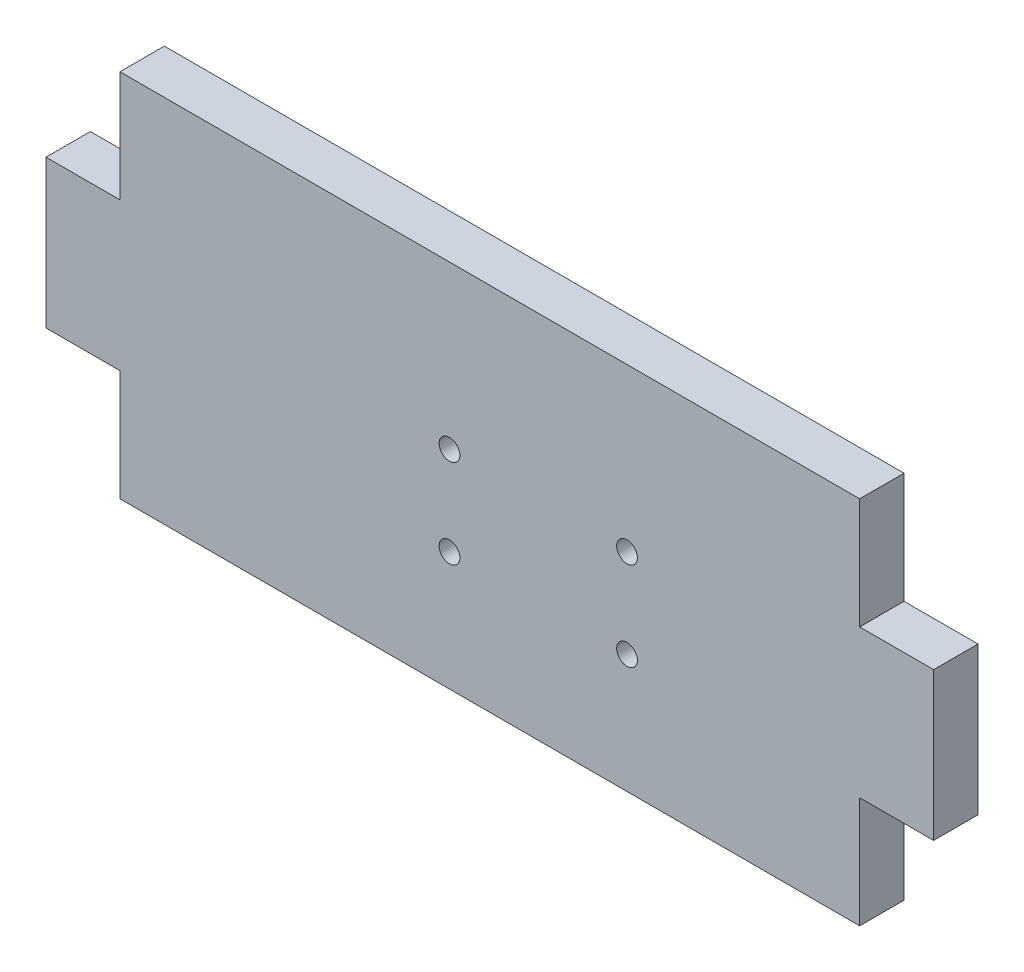
ISO-10303-21;
HEADER;
FILE_DESCRIPTION(('STEP AP214'),'2;1');
FILE_NAME('part.step','',(''),(''),'','','');
FILE_SCHEMA(('AUTOMOTIVE_DESIGN { 1 0 10303 214 1 1 1 1 }'));
ENDSEC;
DATA;
#1=APPLICATION_CONTEXT('core data for automotive mechanical design processes');
#2=APPLICATION_PROTOCOL_DEFINITION('international standard','automotive_design',2000,#1);
#3=PRODUCT_CONTEXT('',#1,'mechanical');
#4=PRODUCT('Part','Part','',(#3));
#5=PRODUCT_RELATED_PRODUCT_CATEGORY('part','',(#4));
#6=PRODUCT_DEFINITION_FORMATION('','',#4);
#7=PRODUCT_DEFINITION_CONTEXT('part definition',#1,'design');
#8=PRODUCT_DEFINITION('design','',#6,#7);
#9=PRODUCT_DEFINITION_SHAPE('','',#8);
#10=(LENGTH_UNIT() NAMED_UNIT(*) SI_UNIT(.MILLI.,.METRE.));
#11=(NAMED_UNIT(*) PLANE_ANGLE_UNIT() SI_UNIT($,.RADIAN.));
#12=(NAMED_UNIT(*) SI_UNIT($,.STERADIAN.) SOLID_ANGLE_UNIT());
#13=UNCERTAINTY_MEASURE_WITH_UNIT(LENGTH_MEASURE(1.E-05),#10,'distance_accuracy_value','');
#14=(GEOMETRIC_REPRESENTATION_CONTEXT(3) GLOBAL_UNCERTAINTY_ASSIGNED_CONTEXT((#13)) GLOBAL_UNIT_ASSIGNED_CONTEXT((#10,
#11,#12)) REPRESENTATION_CONTEXT('',''));
#15=CARTESIAN_POINT('',(0.,0.,0.));
#16=DIRECTION('',(0.,0.,1.));
#17=DIRECTION('',(1.,0.,0.));
#18=AXIS2_PLACEMENT_3D('',#15,#16,#17);
#19=CARTESIAN_POINT('',(44.550340057059,16.0653133446784,9.95979797464467));
#20=DIRECTION('',(0.,0.,-1.));
#21=DIRECTION('',(-1.,0.,0.));
#22=AXIS2_PLACEMENT_3D('',#19,#20,#21);
#23=CYLINDRICAL_SURFACE('',#22,1.4);
#24=CARTESIAN_POINT('',(44.550340057059,16.0653133446784,6.));
#25=DIRECTION('',(0.,0.,1.));
#26=DIRECTION('',(1.,0.,0.));
#27=AXIS2_PLACEMENT_3D('',#24,#25,#26);
#28=CIRCLE('',#27,1.4);
#29=CARTESIAN_POINT('',(45.950340057059,16.0653133446784,6.));
#30=VERTEX_POINT('',#29);
#31=EDGE_CURVE('E167',#30,#30,#28,.F.);
#32=ORIENTED_EDGE('',*,*,#31,.F.);
#33=EDGE_LOOP('',(#32));
#34=FACE_BOUND('',#33,.T.);
#35=CARTESIAN_POINT('',(44.550340057059,16.0653133446784,4.));
#36=DIRECTION('',(0.,0.,-1.));
#37=DIRECTION('',(-1.,0.,0.));
#38=AXIS2_PLACEMENT_3D('',#35,#36,#37);
#39=CIRCLE('',#38,1.4);
#40=CARTESIAN_POINT('',(43.150340057059,16.0653133446784,4.));
#41=VERTEX_POINT('',#40);
#42=EDGE_CURVE('E41',#41,#41,#39,.F.);
#43=ORIENTED_EDGE('',*,*,#42,.F.);
#44=EDGE_LOOP('',(#43));
#45=FACE_BOUND('',#44,.T.);
#46=ADVANCED_FACE('F37',(#34,#45),#23,.F.);
#47=CARTESIAN_POINT('',(44.550340057059,28.0653133446784,9.95979797464467));
#48=DIRECTION('',(0.,0.,-1.));
#49=DIRECTION('',(-1.,0.,0.));
#50=AXIS2_PLACEMENT_3D('',#47,#48,#49);
#51=CYLINDRICAL_SURFACE('',#50,1.4);
#52=CARTESIAN_POINT('',(44.550340057059,28.0653133446784,6.));
#53=DIRECTION('',(0.,0.,1.));
#54=DIRECTION('',(1.,0.,0.));
#55=AXIS2_PLACEMENT_3D('',#52,#53,#54);
#56=CIRCLE('',#55,1.4);
#57=CARTESIAN_POINT('',(45.950340057059,28.0653133446784,6.));
#58=VERTEX_POINT('',#57);
#59=EDGE_CURVE('E230',#58,#58,#56,.F.);
#60=ORIENTED_EDGE('',*,*,#59,.F.);
#61=EDGE_LOOP('',(#60));
#62=FACE_BOUND('',#61,.T.);
#63=CARTESIAN_POINT('',(44.550340057059,28.0653133446784,4.));
#64=DIRECTION('',(0.,0.,-1.));
#65=DIRECTION('',(-1.,0.,0.));
#66=AXIS2_PLACEMENT_3D('',#63,#64,#65);
#67=CIRCLE('',#66,1.4);
#68=CARTESIAN_POINT('',(43.150340057059,28.0653133446784,4.));
#69=VERTEX_POINT('',#68);
#70=EDGE_CURVE('E216',#69,#69,#67,.F.);
#71=ORIENTED_EDGE('',*,*,#70,.F.);
#72=EDGE_LOOP('',(#71));
#73=FACE_BOUND('',#72,.T.);
#74=ADVANCED_FACE('F272',(#62,#73),#51,.F.);
#75=CARTESIAN_POINT('',(68.550340057059,28.0653133446784,9.95979797464467));
#76=DIRECTION('',(0.,0.,-1.));
#77=DIRECTION('',(-1.,0.,0.));
#78=AXIS2_PLACEMENT_3D('',#75,#76,#77);
#79=CYLINDRICAL_SURFACE('',#78,1.4);
#80=CARTESIAN_POINT('',(68.550340057059,28.0653133446784,6.));
#81=DIRECTION('',(0.,0.,1.));
#82=DIRECTION('',(1.,0.,0.));
#83=AXIS2_PLACEMENT_3D('',#80,#81,#82);
#84=CIRCLE('',#83,1.4);
#85=CARTESIAN_POINT('',(69.950340057059,28.0653133446784,6.));
#86=VERTEX_POINT('',#85);
#87=EDGE_CURVE('E225',#86,#86,#84,.F.);
#88=ORIENTED_EDGE('',*,*,#87,.F.);
#89=EDGE_LOOP('',(#88));
#90=FACE_BOUND('',#89,.T.);
#91=CARTESIAN_POINT('',(68.550340057059,28.0653133446784,4.));
#92=DIRECTION('',(0.,0.,-1.));
#93=DIRECTION('',(-1.,0.,0.));
#94=AXIS2_PLACEMENT_3D('',#91,#92,#93);
#95=CIRCLE('',#94,1.4);
#96=CARTESIAN_POINT('',(67.150340057059,28.0653133446784,4.));
#97=VERTEX_POINT('',#96);
#98=EDGE_CURVE('E213',#97,#97,#95,.F.);
#99=ORIENTED_EDGE('',*,*,#98,.F.);
#100=EDGE_LOOP('',(#99));
#101=FACE_BOUND('',#100,.T.);
#102=ADVANCED_FACE('F278',(#90,#101),#79,.F.);
#103=CARTESIAN_POINT('',(68.550340057059,16.0653133446784,9.95979797464467));
#104=DIRECTION('',(0.,0.,-1.));
#105=DIRECTION('',(-1.,0.,0.));
#106=AXIS2_PLACEMENT_3D('',#103,#104,#105);
#107=CYLINDRICAL_SURFACE('',#106,1.4);
#108=CARTESIAN_POINT('',(68.550340057059,16.0653133446784,6.));
#109=DIRECTION('',(0.,0.,1.));
#110=DIRECTION('',(1.,0.,0.));
#111=AXIS2_PLACEMENT_3D('',#108,#109,#110);
#112=CIRCLE('',#111,1.4);
#113=CARTESIAN_POINT('',(69.950340057059,16.0653133446784,6.));
#114=VERTEX_POINT('',#113);
#115=EDGE_CURVE('E221',#114,#114,#112,.F.);
#116=ORIENTED_EDGE('',*,*,#115,.F.);
#117=EDGE_LOOP('',(#116));
#118=FACE_BOUND('',#117,.T.);
#119=CARTESIAN_POINT('',(68.550340057059,16.0653133446784,4.));
#120=DIRECTION('',(0.,0.,-1.));
#121=DIRECTION('',(-1.,0.,0.));
#122=AXIS2_PLACEMENT_3D('',#119,#120,#121);
#123=CIRCLE('',#122,1.4);
#124=CARTESIAN_POINT('',(67.150340057059,16.0653133446784,4.));
#125=VERTEX_POINT('',#124);
#126=EDGE_CURVE('E210',#125,#125,#123,.F.);
#127=ORIENTED_EDGE('',*,*,#126,.F.);
#128=EDGE_LOOP('',(#127));
#129=FACE_BOUND('',#128,.T.);
#130=ADVANCED_FACE('F284',(#118,#129),#107,.F.);
#131=CARTESIAN_POINT('',(0.,35.,6.));
#132=DIRECTION('',(0.,-1.,0.));
#133=DIRECTION('',(0.,0.,-1.));
#134=AXIS2_PLACEMENT_3D('',#131,#132,#133);
#135=PLANE('',#134);
#136=DIRECTION('',(-1.,0.,0.));
#137=VECTOR('',#136,1.);
#138=CARTESIAN_POINT('',(0.,35.,0.));
#139=LINE('',#138,#137);
#140=CARTESIAN_POINT('',(0.,35.,0.));
#141=VERTEX_POINT('',#140);
#142=CARTESIAN_POINT('',(-10.,35.,0.));
#143=VERTEX_POINT('',#142);
#144=EDGE_CURVE('E164',#141,#143,#139,.T.);
#145=ORIENTED_EDGE('',*,*,#144,.T.);
#146=DIRECTION('',(0.,0.,-1.));
#147=VECTOR('',#146,1.);
#148=CARTESIAN_POINT('',(-10.,35.,6.));
#149=LINE('',#148,#147);
#150=CARTESIAN_POINT('',(-10.,35.,6.));
#151=VERTEX_POINT('',#150);
#152=EDGE_CURVE('E11',#151,#143,#149,.T.);
#153=ORIENTED_EDGE('',*,*,#152,.F.);
#154=DIRECTION('',(-1.,0.,0.));
#155=VECTOR('',#154,1.);
#156=CARTESIAN_POINT('',(0.,35.,6.));
#157=LINE('',#156,#155);
#158=CARTESIAN_POINT('',(0.,35.,6.));
#159=VERTEX_POINT('',#158);
#160=EDGE_CURVE('E236',#159,#151,#157,.T.);
#161=ORIENTED_EDGE('',*,*,#160,.F.);
#162=DIRECTION('',(0.,0.,-1.));
#163=VECTOR('',#162,1.);
#164=CARTESIAN_POINT('',(0.,35.,6.));
#165=LINE('',#164,#163);
#166=EDGE_CURVE('E56',#159,#141,#165,.T.);
#167=ORIENTED_EDGE('',*,*,#166,.T.);
#168=EDGE_LOOP('',(#145,#153,#161,#167));
#169=FACE_BOUND('',#168,.T.);
#170=ADVANCED_FACE('F39',(#169),#135,.F.);
#171=CARTESIAN_POINT('',(-10.,0.,6.));
#172=DIRECTION('',(1.,0.,0.));
#173=DIRECTION('',(0.,1.,0.));
#174=AXIS2_PLACEMENT_3D('',#171,#172,#173);
#175=PLANE('',#174);
#176=DIRECTION('',(0.,-1.,0.));
#177=VECTOR('',#176,1.);
#178=CARTESIAN_POINT('',(-10.,0.,0.));
#179=LINE('',#178,#177);
#180=CARTESIAN_POINT('',(-10.,15.,0.));
#181=VERTEX_POINT('',#180);
#182=EDGE_CURVE('E166',#143,#181,#179,.T.);
#183=ORIENTED_EDGE('',*,*,#182,.T.);
#184=DIRECTION('',(0.,0.,-1.));
#185=VECTOR('',#184,1.);
#186=CARTESIAN_POINT('',(-10.,15.,6.));
#187=LINE('',#186,#185);
#188=CARTESIAN_POINT('',(-10.,15.,6.));
#189=VERTEX_POINT('',#188);
#190=EDGE_CURVE('E47',#189,#181,#187,.T.);
#191=ORIENTED_EDGE('',*,*,#190,.F.);
#192=DIRECTION('',(0.,-1.,0.));
#193=VECTOR('',#192,1.);
#194=CARTESIAN_POINT('',(-10.,0.,6.));
#195=LINE('',#194,#193);
#196=EDGE_CURVE('E106',#151,#189,#195,.T.);
#197=ORIENTED_EDGE('',*,*,#196,.F.);
#198=ORIENTED_EDGE('',*,*,#152,.T.);
#199=EDGE_LOOP('',(#183,#191,#197,#198));
#200=FACE_BOUND('',#199,.T.);
#201=ADVANCED_FACE('F376',(#200),#175,.F.);
#202=CARTESIAN_POINT('',(0.,15.,6.));
#203=DIRECTION('',(0.,-1.,0.));
#204=DIRECTION('',(0.,0.,-1.));
#205=AXIS2_PLACEMENT_3D('',#202,#203,#204);
#206=PLANE('',#205);
#207=DIRECTION('',(-1.,0.,0.));
#208=VECTOR('',#207,1.);
#209=CARTESIAN_POINT('',(0.,15.,0.));
#210=LINE('',#209,#208);
#211=CARTESIAN_POINT('',(0.,15.,0.));
#212=VERTEX_POINT('',#211);
#213=EDGE_CURVE('E170',#212,#181,#210,.T.);
#214=ORIENTED_EDGE('',*,*,#213,.F.);
#215=DIRECTION('',(0.,0.,-1.));
#216=VECTOR('',#215,1.);
#217=CARTESIAN_POINT('',(0.,15.,6.));
#218=LINE('',#217,#216);
#219=CARTESIAN_POINT('',(0.,15.,6.));
#220=VERTEX_POINT('',#219);
#221=EDGE_CURVE('E207',#220,#212,#218,.T.);
#222=ORIENTED_EDGE('',*,*,#221,.F.);
#223=DIRECTION('',(-1.,0.,0.));
#224=VECTOR('',#223,1.);
#225=CARTESIAN_POINT('',(0.,15.,6.));
#226=LINE('',#225,#224);
#227=EDGE_CURVE('E239',#220,#189,#226,.T.);
#228=ORIENTED_EDGE('',*,*,#227,.T.);
#229=ORIENTED_EDGE('',*,*,#190,.T.);
#230=EDGE_LOOP('',(#214,#222,#228,#229));
#231=FACE_BOUND('',#230,.T.);
#232=ADVANCED_FACE('F269',(#231),#206,.T.);
#233=CARTESIAN_POINT('',(0.,0.,6.));
#234=DIRECTION('',(-1.,0.,0.));
#235=DIRECTION('',(0.,0.,1.));
#236=AXIS2_PLACEMENT_3D('',#233,#234,#235);
#237=PLANE('',#236);
#238=DIRECTION('',(0.,1.,0.));
#239=VECTOR('',#238,1.);
#240=CARTESIAN_POINT('',(0.,0.,0.));
#241=LINE('',#240,#239);
#242=CARTESIAN_POINT('',(0.,0.,0.));
#243=VERTEX_POINT('',#242);
#244=EDGE_CURVE('E173',#243,#212,#241,.T.);
#245=ORIENTED_EDGE('',*,*,#244,.F.);
#246=DIRECTION('',(0.,0.,-1.));
#247=VECTOR('',#246,1.);
#248=CARTESIAN_POINT('',(0.,0.,6.));
#249=LINE('',#248,#247);
#250=CARTESIAN_POINT('',(0.,0.,6.));
#251=VERTEX_POINT('',#250);
#252=EDGE_CURVE('E205',#251,#243,#249,.T.);
#253=ORIENTED_EDGE('',*,*,#252,.F.);
#254=DIRECTION('',(0.,1.,0.));
#255=VECTOR('',#254,1.);
#256=CARTESIAN_POINT('',(0.,0.,6.));
#257=LINE('',#256,#255);
#258=EDGE_CURVE('E160',#251,#220,#257,.T.);
#259=ORIENTED_EDGE('',*,*,#258,.T.);
#260=ORIENTED_EDGE('',*,*,#221,.T.);
#261=EDGE_LOOP('',(#245,#253,#259,#260));
#262=FACE_BOUND('',#261,.T.);
#263=ADVANCED_FACE('F259',(#262),#237,.T.);
#264=CARTESIAN_POINT('',(0.,0.,6.));
#265=DIRECTION('',(0.,1.,0.));
#266=DIRECTION('',(0.,0.,1.));
#267=AXIS2_PLACEMENT_3D('',#264,#265,#266);
#268=PLANE('',#267);
#269=DIRECTION('',(1.,0.,0.));
#270=VECTOR('',#269,1.);
#271=CARTESIAN_POINT('',(0.,0.,0.));
#272=LINE('',#271,#270);
#273=CARTESIAN_POINT('',(100.,0.,0.));
#274=VERTEX_POINT('',#273);
#275=EDGE_CURVE('E176',#243,#274,#272,.T.);
#276=ORIENTED_EDGE('',*,*,#275,.T.);
#277=DIRECTION('',(0.,0.,-1.));
#278=VECTOR('',#277,1.);
#279=CARTESIAN_POINT('',(100.,0.,6.));
#280=LINE('',#279,#278);
#281=CARTESIAN_POINT('',(100.,0.,6.));
#282=VERTEX_POINT('',#281);
#283=EDGE_CURVE('E202',#282,#274,#280,.T.);
#284=ORIENTED_EDGE('',*,*,#283,.F.);
#285=DIRECTION('',(1.,0.,0.));
#286=VECTOR('',#285,1.);
#287=CARTESIAN_POINT('',(0.,0.,6.));
#288=LINE('',#287,#286);
#289=EDGE_CURVE('E243',#251,#282,#288,.T.);
#290=ORIENTED_EDGE('',*,*,#289,.F.);
#291=ORIENTED_EDGE('',*,*,#252,.T.);
#292=EDGE_LOOP('',(#276,#284,#290,#291));
#293=FACE_BOUND('',#292,.T.);
#294=ADVANCED_FACE('F268',(#293),#268,.F.);
#295=CARTESIAN_POINT('',(100.,0.,6.));
#296=DIRECTION('',(-1.,0.,0.));
#297=DIRECTION('',(0.,0.,1.));
#298=AXIS2_PLACEMENT_3D('',#295,#296,#297);
#299=PLANE('',#298);
#300=DIRECTION('',(0.,1.,0.));
#301=VECTOR('',#300,1.);
#302=CARTESIAN_POINT('',(100.,0.,0.));
#303=LINE('',#302,#301);
#304=CARTESIAN_POINT('',(100.,15.,0.));
#305=VERTEX_POINT('',#304);
#306=EDGE_CURVE('E179',#274,#305,#303,.T.);
#307=ORIENTED_EDGE('',*,*,#306,.T.);
#308=DIRECTION('',(0.,0.,-1.));
#309=VECTOR('',#308,1.);
#310=CARTESIAN_POINT('',(100.,15.,6.));
#311=LINE('',#310,#309);
#312=CARTESIAN_POINT('',(100.,15.,6.));
#313=VERTEX_POINT('',#312);
#314=EDGE_CURVE('E199',#313,#305,#311,.T.);
#315=ORIENTED_EDGE('',*,*,#314,.F.);
#316=DIRECTION('',(0.,1.,0.));
#317=VECTOR('',#316,1.);
#318=CARTESIAN_POINT('',(100.,0.,6.));
#319=LINE('',#318,#317);
#320=EDGE_CURVE('E146',#282,#313,#319,.T.);
#321=ORIENTED_EDGE('',*,*,#320,.F.);
#322=ORIENTED_EDGE('',*,*,#283,.T.);
#323=EDGE_LOOP('',(#307,#315,#321,#322));
#324=FACE_BOUND('',#323,.T.);
#325=ADVANCED_FACE('F398',(#324),#299,.F.);
#326=CARTESIAN_POINT('',(0.,15.,6.));
#327=DIRECTION('',(0.,1.,0.));
#328=DIRECTION('',(0.,0.,1.));
#329=AXIS2_PLACEMENT_3D('',#326,#327,#328);
#330=PLANE('',#329);
#331=DIRECTION('',(1.,0.,0.));
#332=VECTOR('',#331,1.);
#333=CARTESIAN_POINT('',(0.,15.,0.));
#334=LINE('',#333,#332);
#335=CARTESIAN_POINT('',(110.,15.,0.));
#336=VERTEX_POINT('',#335);
#337=EDGE_CURVE('E181',#305,#336,#334,.T.);
#338=ORIENTED_EDGE('',*,*,#337,.T.);
#339=DIRECTION('',(0.,0.,-1.));
#340=VECTOR('',#339,1.);
#341=CARTESIAN_POINT('',(110.,15.,6.));
#342=LINE('',#341,#340);
#343=CARTESIAN_POINT('',(110.,15.,6.));
#344=VERTEX_POINT('',#343);
#345=EDGE_CURVE('E197',#344,#336,#342,.T.);
#346=ORIENTED_EDGE('',*,*,#345,.F.);
#347=DIRECTION('',(1.,0.,0.));
#348=VECTOR('',#347,1.);
#349=CARTESIAN_POINT('',(0.,15.,6.));
#350=LINE('',#349,#348);
#351=EDGE_CURVE('E245',#313,#344,#350,.T.);
#352=ORIENTED_EDGE('',*,*,#351,.F.);
#353=ORIENTED_EDGE('',*,*,#314,.T.);
#354=EDGE_LOOP('',(#338,#346,#352,#353));
#355=FACE_BOUND('',#354,.T.);
#356=ADVANCED_FACE('F402',(#355),#330,.F.);
#357=CARTESIAN_POINT('',(110.,0.,6.));
#358=DIRECTION('',(1.,0.,0.));
#359=DIRECTION('',(0.,0.,-1.));
#360=AXIS2_PLACEMENT_3D('',#357,#358,#359);
#361=PLANE('',#360);
#362=DIRECTION('',(0.,-1.,0.));
#363=VECTOR('',#362,1.);
#364=CARTESIAN_POINT('',(110.,0.,0.));
#365=LINE('',#364,#363);
#366=CARTESIAN_POINT('',(110.,35.,0.));
#367=VERTEX_POINT('',#366);
#368=EDGE_CURVE('E184',#367,#336,#365,.T.);
#369=ORIENTED_EDGE('',*,*,#368,.F.);
#370=DIRECTION('',(0.,0.,-1.));
#371=VECTOR('',#370,1.);
#372=CARTESIAN_POINT('',(110.,35.,6.));
#373=LINE('',#372,#371);
#374=CARTESIAN_POINT('',(110.,35.,6.));
#375=VERTEX_POINT('',#374);
#376=EDGE_CURVE('E195',#375,#367,#373,.T.);
#377=ORIENTED_EDGE('',*,*,#376,.F.);
#378=DIRECTION('',(0.,-1.,0.));
#379=VECTOR('',#378,1.);
#380=CARTESIAN_POINT('',(110.,0.,6.));
#381=LINE('',#380,#379);
#382=EDGE_CURVE('E246',#375,#344,#381,.T.);
#383=ORIENTED_EDGE('',*,*,#382,.T.);
#384=ORIENTED_EDGE('',*,*,#345,.T.);
#385=EDGE_LOOP('',(#369,#377,#383,#384));
#386=FACE_BOUND('',#385,.T.);
#387=ADVANCED_FACE('F403',(#386),#361,.T.);
#388=CARTESIAN_POINT('',(0.,35.,6.));
#389=DIRECTION('',(0.,1.,0.));
#390=DIRECTION('',(0.,0.,1.));
#391=AXIS2_PLACEMENT_3D('',#388,#389,#390);
#392=PLANE('',#391);
#393=DIRECTION('',(1.,0.,0.));
#394=VECTOR('',#393,1.);
#395=CARTESIAN_POINT('',(0.,35.,0.));
#396=LINE('',#395,#394);
#397=CARTESIAN_POINT('',(100.,35.,0.));
#398=VERTEX_POINT('',#397);
#399=EDGE_CURVE('E187',#398,#367,#396,.T.);
#400=ORIENTED_EDGE('',*,*,#399,.F.);
#401=DIRECTION('',(0.,0.,-1.));
#402=VECTOR('',#401,1.);
#403=CARTESIAN_POINT('',(100.,35.,6.));
#404=LINE('',#403,#402);
#405=CARTESIAN_POINT('',(100.,35.,6.));
#406=VERTEX_POINT('',#405);
#407=EDGE_CURVE('E154',#406,#398,#404,.T.);
#408=ORIENTED_EDGE('',*,*,#407,.F.);
#409=DIRECTION('',(1.,0.,0.));
#410=VECTOR('',#409,1.);
#411=CARTESIAN_POINT('',(0.,35.,6.));
#412=LINE('',#411,#410);
#413=EDGE_CURVE('E143',#406,#375,#412,.T.);
#414=ORIENTED_EDGE('',*,*,#413,.T.);
#415=ORIENTED_EDGE('',*,*,#376,.T.);
#416=EDGE_LOOP('',(#400,#408,#414,#415));
#417=FACE_BOUND('',#416,.T.);
#418=ADVANCED_FACE('F251',(#417),#392,.T.);
#419=CARTESIAN_POINT('',(100.,50.,0.));
#420=VERTEX_POINT('',#419);
#421=EDGE_CURVE('E151',#398,#420,#303,.T.);
#422=ORIENTED_EDGE('',*,*,#421,.T.);
#423=DIRECTION('',(0.,0.,-1.));
#424=VECTOR('',#423,1.);
#425=CARTESIAN_POINT('',(100.,50.,6.));
#426=LINE('',#425,#424);
#427=CARTESIAN_POINT('',(100.,50.,6.));
#428=VERTEX_POINT('',#427);
#429=EDGE_CURVE('E148',#428,#420,#426,.T.);
#430=ORIENTED_EDGE('',*,*,#429,.F.);
#431=EDGE_CURVE('E135',#406,#428,#319,.T.);
#432=ORIENTED_EDGE('',*,*,#431,.F.);
#433=ORIENTED_EDGE('',*,*,#407,.T.);
#434=EDGE_LOOP('',(#422,#430,#432,#433));
#435=FACE_BOUND('',#434,.T.);
#436=ADVANCED_FACE('F149',(#435),#299,.F.);
#437=CARTESIAN_POINT('',(0.,50.,6.));
#438=DIRECTION('',(0.,1.,0.));
#439=DIRECTION('',(0.,0.,1.));
#440=AXIS2_PLACEMENT_3D('',#437,#438,#439);
#441=PLANE('',#440);
#442=DIRECTION('',(1.,0.,0.));
#443=VECTOR('',#442,1.);
#444=CARTESIAN_POINT('',(0.,50.,0.));
#445=LINE('',#444,#443);
#446=CARTESIAN_POINT('',(0.,50.,0.));
#447=VERTEX_POINT('',#446);
#448=EDGE_CURVE('E190',#447,#420,#445,.T.);
#449=ORIENTED_EDGE('',*,*,#448,.F.);
#450=DIRECTION('',(0.,0.,-1.));
#451=VECTOR('',#450,1.);
#452=CARTESIAN_POINT('',(0.,50.,6.));
#453=LINE('',#452,#451);
#454=CARTESIAN_POINT('',(0.,50.,6.));
#455=VERTEX_POINT('',#454);
#456=EDGE_CURVE('E94',#455,#447,#453,.T.);
#457=ORIENTED_EDGE('',*,*,#456,.F.);
#458=DIRECTION('',(1.,0.,0.));
#459=VECTOR('',#458,1.);
#460=CARTESIAN_POINT('',(0.,50.,6.));
#461=LINE('',#460,#459);
#462=EDGE_CURVE('E140',#455,#428,#461,.T.);
#463=ORIENTED_EDGE('',*,*,#462,.T.);
#464=ORIENTED_EDGE('',*,*,#429,.T.);
#465=EDGE_LOOP('',(#449,#457,#463,#464));
#466=FACE_BOUND('',#465,.T.);
#467=ADVANCED_FACE('F156',(#466),#441,.T.);
#468=EDGE_CURVE('E177',#141,#447,#241,.T.);
#469=ORIENTED_EDGE('',*,*,#468,.F.);
#470=ORIENTED_EDGE('',*,*,#166,.F.);
#471=EDGE_CURVE('E157',#159,#455,#257,.T.);
#472=ORIENTED_EDGE('',*,*,#471,.T.);
#473=ORIENTED_EDGE('',*,*,#456,.T.);
#474=EDGE_LOOP('',(#469,#470,#472,#473));
#475=FACE_BOUND('',#474,.T.);
#476=ADVANCED_FACE('F256',(#475),#237,.T.);
#477=CARTESIAN_POINT('',(0.,0.,6.));
#478=DIRECTION('',(0.,0.,1.));
#479=DIRECTION('',(1.,0.,0.));
#480=AXIS2_PLACEMENT_3D('',#477,#478,#479);
#481=PLANE('',#480);
#482=ORIENTED_EDGE('',*,*,#115,.T.);
#483=EDGE_LOOP('',(#482));
#484=FACE_BOUND('',#483,.T.);
#485=ORIENTED_EDGE('',*,*,#87,.T.);
#486=EDGE_LOOP('',(#485));
#487=FACE_BOUND('',#486,.T.);
#488=ORIENTED_EDGE('',*,*,#59,.T.);
#489=EDGE_LOOP('',(#488));
#490=FACE_BOUND('',#489,.T.);
#491=ORIENTED_EDGE('',*,*,#31,.T.);
#492=EDGE_LOOP('',(#491));
#493=FACE_BOUND('',#492,.T.);
#494=ORIENTED_EDGE('',*,*,#160,.T.);
#495=ORIENTED_EDGE('',*,*,#196,.T.);
#496=ORIENTED_EDGE('',*,*,#227,.F.);
#497=ORIENTED_EDGE('',*,*,#258,.F.);
#498=ORIENTED_EDGE('',*,*,#289,.T.);
#499=ORIENTED_EDGE('',*,*,#320,.T.);
#500=ORIENTED_EDGE('',*,*,#351,.T.);
#501=ORIENTED_EDGE('',*,*,#382,.F.);
#502=ORIENTED_EDGE('',*,*,#413,.F.);
#503=ORIENTED_EDGE('',*,*,#431,.T.);
#504=ORIENTED_EDGE('',*,*,#462,.F.);
#505=ORIENTED_EDGE('',*,*,#471,.F.);
#506=EDGE_LOOP('',(#494,#495,#496,#497,#498,#499,#500,#501,#502,#503,#504,#505));
#507=FACE_BOUND('',#506,.T.);
#508=ADVANCED_FACE('F137',(#484,#487,#490,#493,#507),#481,.T.);
#509=CARTESIAN_POINT('',(0.,0.,0.));
#510=DIRECTION('',(0.,0.,1.));
#511=DIRECTION('',(1.,0.,0.));
#512=AXIS2_PLACEMENT_3D('',#509,#510,#511);
#513=PLANE('',#512);
#514=CARTESIAN_POINT('',(68.550340057059,16.0653133446784,0.));
#515=DIRECTION('',(0.,0.,-1.));
#516=DIRECTION('',(-1.,0.,0.));
#517=AXIS2_PLACEMENT_3D('',#514,#515,#516);
#518=CIRCLE('',#517,3.00000000000001);
#519=CARTESIAN_POINT('',(65.550340057059,16.0653133446784,0.));
#520=VERTEX_POINT('',#519);
#521=EDGE_CURVE('E298',#520,#520,#518,.T.);
#522=ORIENTED_EDGE('',*,*,#521,.F.);
#523=EDGE_LOOP('',(#522));
#524=FACE_BOUND('',#523,.T.);
#525=CARTESIAN_POINT('',(44.550340057059,16.0653133446784,0.));
#526=DIRECTION('',(0.,0.,-1.));
#527=DIRECTION('',(-1.,0.,0.));
#528=AXIS2_PLACEMENT_3D('',#525,#526,#527);
#529=CIRCLE('',#528,3.);
#530=CARTESIAN_POINT('',(41.550340057059,16.0653133446784,0.));
#531=VERTEX_POINT('',#530);
#532=EDGE_CURVE('E302',#531,#531,#529,.T.);
#533=ORIENTED_EDGE('',*,*,#532,.F.);
#534=EDGE_LOOP('',(#533));
#535=FACE_BOUND('',#534,.T.);
#536=CARTESIAN_POINT('',(44.550340057059,28.0653133446784,0.));
#537=DIRECTION('',(0.,0.,-1.));
#538=DIRECTION('',(-1.,0.,0.));
#539=AXIS2_PLACEMENT_3D('',#536,#537,#538);
#540=CIRCLE('',#539,3.);
#541=CARTESIAN_POINT('',(41.550340057059,28.0653133446784,0.));
#542=VERTEX_POINT('',#541);
#543=EDGE_CURVE('E306',#542,#542,#540,.T.);
#544=ORIENTED_EDGE('',*,*,#543,.F.);
#545=EDGE_LOOP('',(#544));
#546=FACE_BOUND('',#545,.T.);
#547=CARTESIAN_POINT('',(68.550340057059,28.0653133446784,0.));
#548=DIRECTION('',(0.,0.,-1.));
#549=DIRECTION('',(-1.,0.,0.));
#550=AXIS2_PLACEMENT_3D('',#547,#548,#549);
#551=CIRCLE('',#550,3.00000000000001);
#552=CARTESIAN_POINT('',(65.550340057059,28.0653133446784,0.));
#553=VERTEX_POINT('',#552);
#554=EDGE_CURVE('E309',#553,#553,#551,.T.);
#555=ORIENTED_EDGE('',*,*,#554,.F.);
#556=EDGE_LOOP('',(#555));
#557=FACE_BOUND('',#556,.T.);
#558=ORIENTED_EDGE('',*,*,#144,.F.);
#559=ORIENTED_EDGE('',*,*,#468,.T.);
#560=ORIENTED_EDGE('',*,*,#448,.T.);
#561=ORIENTED_EDGE('',*,*,#421,.F.);
#562=ORIENTED_EDGE('',*,*,#399,.T.);
#563=ORIENTED_EDGE('',*,*,#368,.T.);
#564=ORIENTED_EDGE('',*,*,#337,.F.);
#565=ORIENTED_EDGE('',*,*,#306,.F.);
#566=ORIENTED_EDGE('',*,*,#275,.F.);
#567=ORIENTED_EDGE('',*,*,#244,.T.);
#568=ORIENTED_EDGE('',*,*,#213,.T.);
#569=ORIENTED_EDGE('',*,*,#182,.F.);
#570=EDGE_LOOP('',(#558,#559,#560,#561,#562,#563,#564,#565,#566,#567,#568,#569));
#571=FACE_BOUND('',#570,.T.);
#572=ADVANCED_FACE('F254',(#524,#535,#546,#557,#571),#513,.F.);
#573=CARTESIAN_POINT('',(68.550340057059,16.0653133446784,4.));
#574=DIRECTION('',(0.,0.,-1.));
#575=DIRECTION('',(-1.,0.,0.));
#576=AXIS2_PLACEMENT_3D('',#573,#574,#575);
#577=PLANE('',#576);
#578=CARTESIAN_POINT('',(68.550340057059,16.0653133446784,4.));
#579=DIRECTION('',(0.,0.,-1.));
#580=DIRECTION('',(-1.,0.,0.));
#581=AXIS2_PLACEMENT_3D('',#578,#579,#580);
#582=CIRCLE('',#581,3.00000000000001);
#583=CARTESIAN_POINT('',(65.550340057059,16.0653133446784,4.));
#584=VERTEX_POINT('',#583);
#585=EDGE_CURVE('E324',#584,#584,#582,.T.);
#586=ORIENTED_EDGE('',*,*,#585,.T.);
#587=EDGE_LOOP('',(#586));
#588=FACE_BOUND('',#587,.T.);
#589=ORIENTED_EDGE('',*,*,#126,.T.);
#590=EDGE_LOOP('',(#589));
#591=FACE_BOUND('',#590,.T.);
#592=ADVANCED_FACE('F287',(#588,#591),#577,.T.);
#593=CARTESIAN_POINT('',(68.550340057059,16.0653133446784,4.));
#594=DIRECTION('',(0.,0.,-1.));
#595=DIRECTION('',(-1.,0.,0.));
#596=AXIS2_PLACEMENT_3D('',#593,#594,#595);
#597=CYLINDRICAL_SURFACE('',#596,3.00000000000001);
#598=ORIENTED_EDGE('',*,*,#585,.F.);
#599=EDGE_LOOP('',(#598));
#600=FACE_BOUND('',#599,.T.);
#601=ORIENTED_EDGE('',*,*,#521,.T.);
#602=EDGE_LOOP('',(#601));
#603=FACE_BOUND('',#602,.T.);
#604=ADVANCED_FACE('F292',(#600,#603),#597,.F.);
#605=CARTESIAN_POINT('',(68.550340057059,28.0653133446784,4.));
#606=DIRECTION('',(0.,0.,-1.));
#607=DIRECTION('',(-1.,0.,0.));
#608=AXIS2_PLACEMENT_3D('',#605,#606,#607);
#609=PLANE('',#608);
#610=CARTESIAN_POINT('',(68.550340057059,28.0653133446784,4.));
#611=DIRECTION('',(0.,0.,-1.));
#612=DIRECTION('',(-1.,0.,0.));
#613=AXIS2_PLACEMENT_3D('',#610,#611,#612);
#614=CIRCLE('',#613,3.00000000000001);
#615=CARTESIAN_POINT('',(65.550340057059,28.0653133446784,4.));
#616=VERTEX_POINT('',#615);
#617=EDGE_CURVE('E214',#616,#616,#614,.T.);
#618=ORIENTED_EDGE('',*,*,#617,.T.);
#619=EDGE_LOOP('',(#618));
#620=FACE_BOUND('',#619,.T.);
#621=ORIENTED_EDGE('',*,*,#98,.T.);
#622=EDGE_LOOP('',(#621));
#623=FACE_BOUND('',#622,.T.);
#624=ADVANCED_FACE('F355',(#620,#623),#609,.T.);
#625=CARTESIAN_POINT('',(68.550340057059,28.0653133446784,4.));
#626=DIRECTION('',(0.,0.,-1.));
#627=DIRECTION('',(-1.,0.,0.));
#628=AXIS2_PLACEMENT_3D('',#625,#626,#627);
#629=CYLINDRICAL_SURFACE('',#628,3.00000000000001);
#630=ORIENTED_EDGE('',*,*,#617,.F.);
#631=EDGE_LOOP('',(#630));
#632=FACE_BOUND('',#631,.T.);
#633=ORIENTED_EDGE('',*,*,#554,.T.);
#634=EDGE_LOOP('',(#633));
#635=FACE_BOUND('',#634,.T.);
#636=ADVANCED_FACE('F345',(#632,#635),#629,.F.);
#637=CARTESIAN_POINT('',(44.550340057059,28.0653133446784,4.));
#638=DIRECTION('',(0.,0.,-1.));
#639=DIRECTION('',(-1.,0.,0.));
#640=AXIS2_PLACEMENT_3D('',#637,#638,#639);
#641=PLANE('',#640);
#642=CARTESIAN_POINT('',(44.550340057059,28.0653133446784,4.));
#643=DIRECTION('',(0.,0.,-1.));
#644=DIRECTION('',(-1.,0.,0.));
#645=AXIS2_PLACEMENT_3D('',#642,#643,#644);
#646=CIRCLE('',#645,3.);
#647=CARTESIAN_POINT('',(41.550340057059,28.0653133446784,4.));
#648=VERTEX_POINT('',#647);
#649=EDGE_CURVE('E311',#648,#648,#646,.T.);
#650=ORIENTED_EDGE('',*,*,#649,.T.);
#651=EDGE_LOOP('',(#650));
#652=FACE_BOUND('',#651,.T.);
#653=ORIENTED_EDGE('',*,*,#70,.T.);
#654=EDGE_LOOP('',(#653));
#655=FACE_BOUND('',#654,.T.);
#656=ADVANCED_FACE('F335',(#652,#655),#641,.T.);
#657=CARTESIAN_POINT('',(44.550340057059,28.0653133446784,4.));
#658=DIRECTION('',(0.,0.,-1.));
#659=DIRECTION('',(-1.,0.,0.));
#660=AXIS2_PLACEMENT_3D('',#657,#658,#659);
#661=CYLINDRICAL_SURFACE('',#660,3.);
#662=ORIENTED_EDGE('',*,*,#649,.F.);
#663=EDGE_LOOP('',(#662));
#664=FACE_BOUND('',#663,.T.);
#665=ORIENTED_EDGE('',*,*,#543,.T.);
#666=EDGE_LOOP('',(#665));
#667=FACE_BOUND('',#666,.T.);
#668=ADVANCED_FACE('F332',(#664,#667),#661,.F.);
#669=CARTESIAN_POINT('',(44.550340057059,16.0653133446784,4.));
#670=DIRECTION('',(0.,0.,-1.));
#671=DIRECTION('',(-1.,0.,0.));
#672=AXIS2_PLACEMENT_3D('',#669,#670,#671);
#673=PLANE('',#672);
#674=CARTESIAN_POINT('',(44.550340057059,16.0653133446784,4.));
#675=DIRECTION('',(0.,0.,-1.));
#676=DIRECTION('',(-1.,0.,0.));
#677=AXIS2_PLACEMENT_3D('',#674,#675,#676);
#678=CIRCLE('',#677,3.);
#679=CARTESIAN_POINT('',(41.550340057059,16.0653133446784,4.));
#680=VERTEX_POINT('',#679);
#681=EDGE_CURVE('E328',#680,#680,#678,.T.);
#682=ORIENTED_EDGE('',*,*,#681,.T.);
#683=EDGE_LOOP('',(#682));
#684=FACE_BOUND('',#683,.T.);
#685=ORIENTED_EDGE('',*,*,#42,.T.);
#686=EDGE_LOOP('',(#685));
#687=FACE_BOUND('',#686,.T.);
#688=ADVANCED_FACE('F334',(#684,#687),#673,.T.);
#689=CARTESIAN_POINT('',(44.550340057059,16.0653133446784,4.));
#690=DIRECTION('',(0.,0.,-1.));
#691=DIRECTION('',(-1.,0.,0.));
#692=AXIS2_PLACEMENT_3D('',#689,#690,#691);
#693=CYLINDRICAL_SURFACE('',#692,3.);
#694=ORIENTED_EDGE('',*,*,#681,.F.);
#695=EDGE_LOOP('',(#694));
#696=FACE_BOUND('',#695,.T.);
#697=ORIENTED_EDGE('',*,*,#532,.T.);
#698=EDGE_LOOP('',(#697));
#699=FACE_BOUND('',#698,.T.);
#700=ADVANCED_FACE('F342',(#696,#699),#693,.F.);
#701=CLOSED_SHELL('',(#46,#74,#102,#130,#170,#201,#232,#263,#294,#325,#356,#387,#418,#436,#467,
#476,#508,#572,#592,#604,#624,#636,#656,#668,#688,#700));
#702=MANIFOLD_SOLID_BREP('B2',#701);
#703=ADVANCED_BREP_SHAPE_REPRESENTATION('',(#18,#702),#14);
#704=SHAPE_DEFINITION_REPRESENTATION(#9,#703);
ENDSEC;
END-ISO-10303-21;
